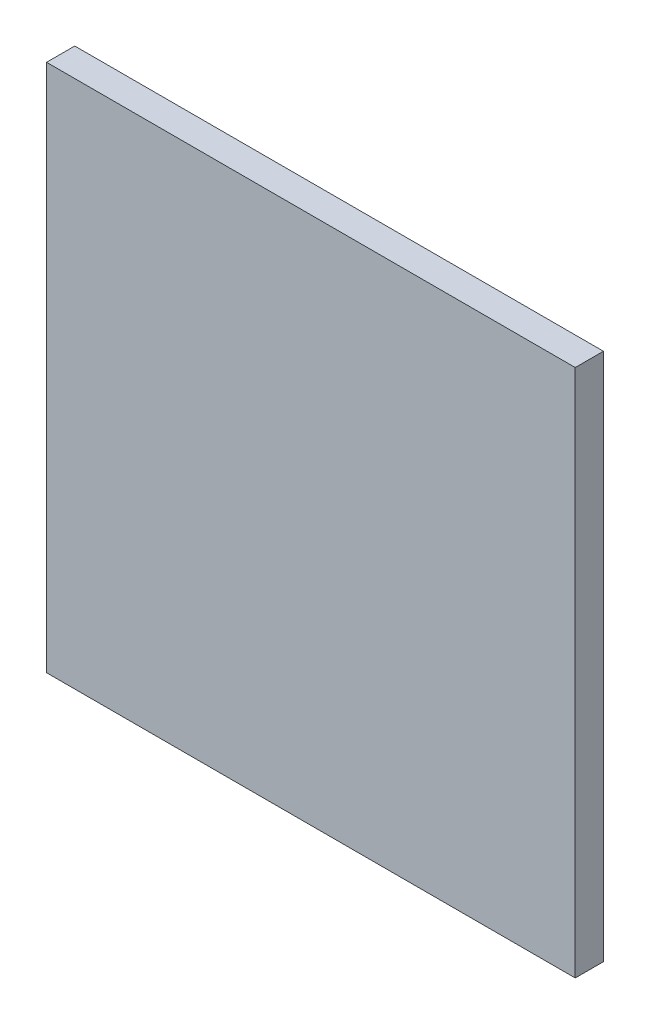
ISO-10303-21;
HEADER;
FILE_DESCRIPTION(('STEP AP214'),'2;1');
FILE_NAME('part.step','',(''),(''),'','','');
FILE_SCHEMA(('AUTOMOTIVE_DESIGN { 1 0 10303 214 1 1 1 1 }'));
ENDSEC;
DATA;
#1=APPLICATION_CONTEXT('core data for automotive mechanical design processes');
#2=APPLICATION_PROTOCOL_DEFINITION('international standard','automotive_design',2000,#1);
#3=PRODUCT_CONTEXT('',#1,'mechanical');
#4=PRODUCT('Part','Part','',(#3));
#5=PRODUCT_RELATED_PRODUCT_CATEGORY('part','',(#4));
#6=PRODUCT_DEFINITION_FORMATION('','',#4);
#7=PRODUCT_DEFINITION_CONTEXT('part definition',#1,'design');
#8=PRODUCT_DEFINITION('design','',#6,#7);
#9=PRODUCT_DEFINITION_SHAPE('','',#8);
#10=(LENGTH_UNIT() NAMED_UNIT(*) SI_UNIT(.MILLI.,.METRE.));
#11=(NAMED_UNIT(*) PLANE_ANGLE_UNIT() SI_UNIT($,.RADIAN.));
#12=(NAMED_UNIT(*) SI_UNIT($,.STERADIAN.) SOLID_ANGLE_UNIT());
#13=UNCERTAINTY_MEASURE_WITH_UNIT(LENGTH_MEASURE(1.E-05),#10,'distance_accuracy_value','');
#14=(GEOMETRIC_REPRESENTATION_CONTEXT(3) GLOBAL_UNCERTAINTY_ASSIGNED_CONTEXT((#13)) GLOBAL_UNIT_ASSIGNED_CONTEXT((#10,
#11,#12)) REPRESENTATION_CONTEXT('',''));
#15=CARTESIAN_POINT('',(0.,0.,0.));
#16=DIRECTION('',(0.,0.,1.));
#17=DIRECTION('',(1.,0.,0.));
#18=AXIS2_PLACEMENT_3D('',#15,#16,#17);
#19=CARTESIAN_POINT('',(44.3928726132587,35.4948717948724,4.06399999999996));
#20=DIRECTION('',(1.,0.,0.));
#21=DIRECTION('',(0.,1.,0.));
#22=AXIS2_PLACEMENT_3D('',#19,#20,#21);
#23=PLANE('',#22);
#24=DIRECTION('',(0.,-1.,0.));
#25=VECTOR('',#24,1.);
#26=CARTESIAN_POINT('',(44.3928726132587,35.4948717948724,0.));
#27=LINE('',#26,#25);
#28=CARTESIAN_POINT('',(44.3928726132587,35.4948717948724,0.));
#29=VERTEX_POINT('',#28);
#30=CARTESIAN_POINT('',(44.3928726132587,-40.7051282051276,0.));
#31=VERTEX_POINT('',#30);
#32=EDGE_CURVE('E105',#29,#31,#27,.T.);
#33=ORIENTED_EDGE('',*,*,#32,.T.);
#34=DIRECTION('',(0.,0.,-1.));
#35=VECTOR('',#34,1.);
#36=CARTESIAN_POINT('',(44.3928726132587,-40.7051282051276,4.06399999999996));
#37=LINE('',#36,#35);
#38=CARTESIAN_POINT('',(44.3928726132587,-40.7051282051276,4.06399999999996));
#39=VERTEX_POINT('',#38);
#40=EDGE_CURVE('E11',#39,#31,#37,.T.);
#41=ORIENTED_EDGE('',*,*,#40,.F.);
#42=DIRECTION('',(0.,-1.,0.));
#43=VECTOR('',#42,1.);
#44=CARTESIAN_POINT('',(44.3928726132587,35.4948717948724,4.06399999999996));
#45=LINE('',#44,#43);
#46=CARTESIAN_POINT('',(44.3928726132587,35.4948717948724,4.06399999999996));
#47=VERTEX_POINT('',#46);
#48=EDGE_CURVE('E88',#47,#39,#45,.T.);
#49=ORIENTED_EDGE('',*,*,#48,.F.);
#50=DIRECTION('',(0.,0.,-1.));
#51=VECTOR('',#50,1.);
#52=CARTESIAN_POINT('',(44.3928726132587,35.4948717948724,4.06399999999996));
#53=LINE('',#52,#51);
#54=EDGE_CURVE('E101',#47,#29,#53,.T.);
#55=ORIENTED_EDGE('',*,*,#54,.T.);
#56=EDGE_LOOP('',(#33,#41,#49,#55));
#57=FACE_BOUND('',#56,.T.);
#58=ADVANCED_FACE('F36',(#57),#23,.F.);
#59=CARTESIAN_POINT('',(44.3928726132587,-40.7051282051276,4.06399999999996));
#60=DIRECTION('',(0.,1.,0.));
#61=DIRECTION('',(0.,0.,1.));
#62=AXIS2_PLACEMENT_3D('',#59,#60,#61);
#63=PLANE('',#62);
#64=DIRECTION('',(1.,0.,0.));
#65=VECTOR('',#64,1.);
#66=CARTESIAN_POINT('',(44.3928726132587,-40.7051282051276,0.));
#67=LINE('',#66,#65);
#68=CARTESIAN_POINT('',(120.592872613259,-40.7051282051276,0.));
#69=VERTEX_POINT('',#68);
#70=EDGE_CURVE('E93',#31,#69,#67,.T.);
#71=ORIENTED_EDGE('',*,*,#70,.T.);
#72=DIRECTION('',(0.,0.,-1.));
#73=VECTOR('',#72,1.);
#74=CARTESIAN_POINT('',(120.592872613259,-40.7051282051276,4.06399999999996));
#75=LINE('',#74,#73);
#76=CARTESIAN_POINT('',(120.592872613259,-40.7051282051276,4.06399999999996));
#77=VERTEX_POINT('',#76);
#78=EDGE_CURVE('E45',#77,#69,#75,.T.);
#79=ORIENTED_EDGE('',*,*,#78,.F.);
#80=DIRECTION('',(1.,0.,0.));
#81=VECTOR('',#80,1.);
#82=CARTESIAN_POINT('',(44.3928726132587,-40.7051282051276,4.06399999999996));
#83=LINE('',#82,#81);
#84=EDGE_CURVE('E83',#39,#77,#83,.T.);
#85=ORIENTED_EDGE('',*,*,#84,.F.);
#86=ORIENTED_EDGE('',*,*,#40,.T.);
#87=EDGE_LOOP('',(#71,#79,#85,#86));
#88=FACE_BOUND('',#87,.T.);
#89=ADVANCED_FACE('F92',(#88),#63,.F.);
#90=CARTESIAN_POINT('',(120.592872613259,35.4948717948724,4.06399999999996));
#91=DIRECTION('',(-1.,0.,0.));
#92=DIRECTION('',(0.,0.,1.));
#93=AXIS2_PLACEMENT_3D('',#90,#91,#92);
#94=PLANE('',#93);
#95=DIRECTION('',(0.,1.,0.));
#96=VECTOR('',#95,1.);
#97=CARTESIAN_POINT('',(120.592872613259,35.4948717948724,0.));
#98=LINE('',#97,#96);
#99=CARTESIAN_POINT('',(120.592872613259,35.4948717948724,0.));
#100=VERTEX_POINT('',#99);
#101=EDGE_CURVE('E70',#69,#100,#98,.T.);
#102=ORIENTED_EDGE('',*,*,#101,.T.);
#103=DIRECTION('',(0.,0.,-1.));
#104=VECTOR('',#103,1.);
#105=CARTESIAN_POINT('',(120.592872613259,35.4948717948724,4.06399999999996));
#106=LINE('',#105,#104);
#107=CARTESIAN_POINT('',(120.592872613259,35.4948717948724,4.06399999999996));
#108=VERTEX_POINT('',#107);
#109=EDGE_CURVE('E95',#108,#100,#106,.T.);
#110=ORIENTED_EDGE('',*,*,#109,.F.);
#111=DIRECTION('',(0.,1.,0.));
#112=VECTOR('',#111,1.);
#113=CARTESIAN_POINT('',(120.592872613259,35.4948717948724,4.06399999999996));
#114=LINE('',#113,#112);
#115=EDGE_CURVE('E86',#77,#108,#114,.T.);
#116=ORIENTED_EDGE('',*,*,#115,.F.);
#117=ORIENTED_EDGE('',*,*,#78,.T.);
#118=EDGE_LOOP('',(#102,#110,#116,#117));
#119=FACE_BOUND('',#118,.T.);
#120=ADVANCED_FACE('F96',(#119),#94,.F.);
#121=CARTESIAN_POINT('',(44.3928726132587,35.4948717948724,4.06399999999996));
#122=DIRECTION('',(0.,-1.,0.));
#123=DIRECTION('',(0.,0.,-1.));
#124=AXIS2_PLACEMENT_3D('',#121,#122,#123);
#125=PLANE('',#124);
#126=DIRECTION('',(-1.,0.,0.));
#127=VECTOR('',#126,1.);
#128=CARTESIAN_POINT('',(44.3928726132587,35.4948717948724,0.));
#129=LINE('',#128,#127);
#130=EDGE_CURVE('E76',#100,#29,#129,.T.);
#131=ORIENTED_EDGE('',*,*,#130,.T.);
#132=ORIENTED_EDGE('',*,*,#54,.F.);
#133=DIRECTION('',(-1.,0.,0.));
#134=VECTOR('',#133,1.);
#135=CARTESIAN_POINT('',(44.3928726132587,35.4948717948724,4.06399999999996));
#136=LINE('',#135,#134);
#137=EDGE_CURVE('E53',#108,#47,#136,.T.);
#138=ORIENTED_EDGE('',*,*,#137,.F.);
#139=ORIENTED_EDGE('',*,*,#109,.T.);
#140=EDGE_LOOP('',(#131,#132,#138,#139));
#141=FACE_BOUND('',#140,.T.);
#142=ADVANCED_FACE('F119',(#141),#125,.F.);
#143=CARTESIAN_POINT('',(0.,0.,4.06399999999996));
#144=DIRECTION('',(0.,0.,1.));
#145=DIRECTION('',(1.,0.,0.));
#146=AXIS2_PLACEMENT_3D('',#143,#144,#145);
#147=PLANE('',#146);
#148=ORIENTED_EDGE('',*,*,#48,.T.);
#149=ORIENTED_EDGE('',*,*,#84,.T.);
#150=ORIENTED_EDGE('',*,*,#115,.T.);
#151=ORIENTED_EDGE('',*,*,#137,.T.);
#152=EDGE_LOOP('',(#148,#149,#150,#151));
#153=FACE_BOUND('',#152,.T.);
#154=ADVANCED_FACE('F84',(#153),#147,.T.);
#155=CARTESIAN_POINT('',(0.,0.,0.));
#156=DIRECTION('',(0.,0.,1.));
#157=DIRECTION('',(1.,0.,0.));
#158=AXIS2_PLACEMENT_3D('',#155,#156,#157);
#159=PLANE('',#158);
#160=ORIENTED_EDGE('',*,*,#32,.F.);
#161=ORIENTED_EDGE('',*,*,#130,.F.);
#162=ORIENTED_EDGE('',*,*,#101,.F.);
#163=ORIENTED_EDGE('',*,*,#70,.F.);
#164=EDGE_LOOP('',(#160,#161,#162,#163));
#165=FACE_BOUND('',#164,.T.);
#166=ADVANCED_FACE('F122',(#165),#159,.F.);
#167=CLOSED_SHELL('',(#58,#89,#120,#142,#154,#166));
#168=MANIFOLD_SOLID_BREP('B2',#167);
#169=ADVANCED_BREP_SHAPE_REPRESENTATION('',(#18,#168),#14);
#170=SHAPE_DEFINITION_REPRESENTATION(#9,#169);
ENDSEC;
END-ISO-10303-21;
